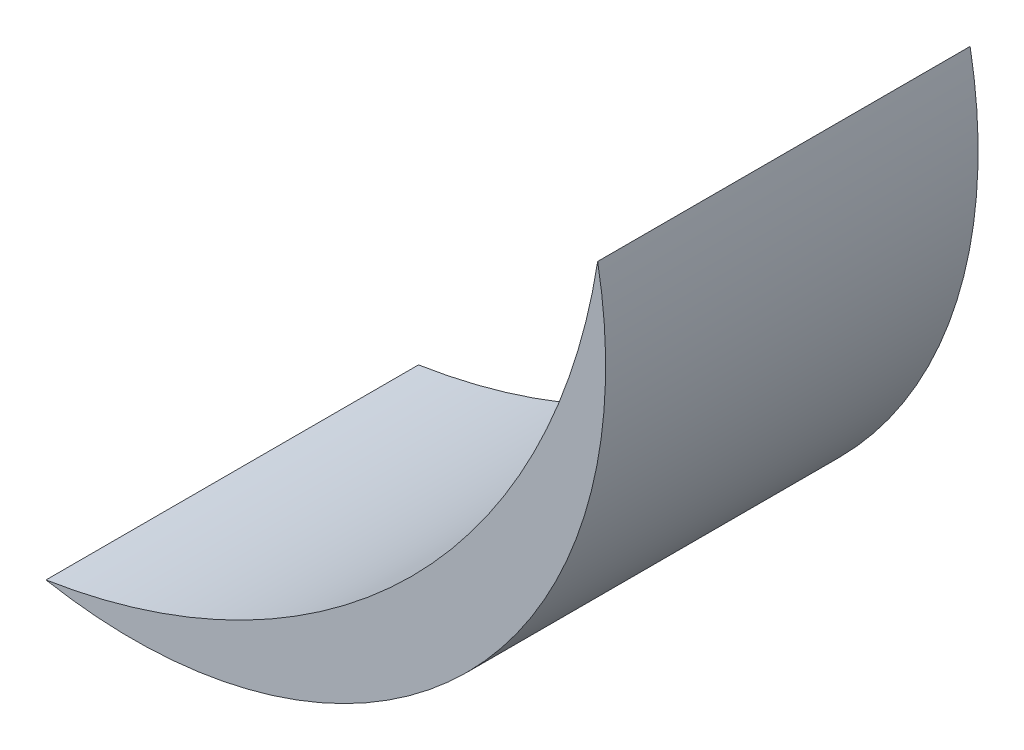
ISO-10303-21;
HEADER;
FILE_DESCRIPTION(('STEP AP214'),'2;1');
FILE_NAME('part.step','',(''),(''),'','','');
FILE_SCHEMA(('AUTOMOTIVE_DESIGN { 1 0 10303 214 1 1 1 1 }'));
ENDSEC;
DATA;
#1=APPLICATION_CONTEXT('core data for automotive mechanical design processes');
#2=APPLICATION_PROTOCOL_DEFINITION('international standard','automotive_design',2000,#1);
#3=PRODUCT_CONTEXT('',#1,'mechanical');
#4=PRODUCT('Part','Part','',(#3));
#5=PRODUCT_RELATED_PRODUCT_CATEGORY('part','',(#4));
#6=PRODUCT_DEFINITION_FORMATION('','',#4);
#7=PRODUCT_DEFINITION_CONTEXT('part definition',#1,'design');
#8=PRODUCT_DEFINITION('design','',#6,#7);
#9=PRODUCT_DEFINITION_SHAPE('','',#8);
#10=(LENGTH_UNIT() NAMED_UNIT(*) SI_UNIT(.MILLI.,.METRE.));
#11=(NAMED_UNIT(*) PLANE_ANGLE_UNIT() SI_UNIT($,.RADIAN.));
#12=(NAMED_UNIT(*) SI_UNIT($,.STERADIAN.) SOLID_ANGLE_UNIT());
#13=UNCERTAINTY_MEASURE_WITH_UNIT(LENGTH_MEASURE(1.E-05),#10,'distance_accuracy_value','');
#14=(GEOMETRIC_REPRESENTATION_CONTEXT(3) GLOBAL_UNCERTAINTY_ASSIGNED_CONTEXT((#13)) GLOBAL_UNIT_ASSIGNED_CONTEXT((#10,
#11,#12)) REPRESENTATION_CONTEXT('',''));
#15=CARTESIAN_POINT('',(0.,0.,0.));
#16=DIRECTION('',(0.,0.,1.));
#17=DIRECTION('',(1.,0.,0.));
#18=AXIS2_PLACEMENT_3D('',#15,#16,#17);
#19=CARTESIAN_POINT('',(119.35459873,97.81540127,0.));
#20=DIRECTION('',(0.,0.,-1.));
#21=DIRECTION('',(-0.707106781186576,-0.70710678118652,0.));
#22=AXIS2_PLACEMENT_3D('',#19,#20,#21);
#23=CYLINDRICAL_SURFACE('',#22,0.253999360179539);
#24=CARTESIAN_POINT('',(119.35459873,97.81540127,0.1999996));
#25=DIRECTION('',(0.,0.,1.));
#26=DIRECTION('',(-0.707106781186576,-0.70710678118652,0.));
#27=AXIS2_PLACEMENT_3D('',#24,#25,#26);
#28=CIRCLE('',#27,0.253999360179539);
#29=CARTESIAN_POINT('',(119.308098731475,97.5656945918579,0.1999996));
#30=VERTEX_POINT('',#29);
#31=CARTESIAN_POINT('',(119.604305408142,97.8619012685254,0.1999996));
#32=VERTEX_POINT('',#31);
#33=EDGE_CURVE('E11',#30,#32,#28,.T.);
#34=ORIENTED_EDGE('',*,*,#33,.F.);
#35=DIRECTION('',(0.,0.,1.));
#36=VECTOR('',#35,1.);
#37=CARTESIAN_POINT('',(119.308098731475,97.5656945918579,0.));
#38=LINE('',#37,#36);
#39=CARTESIAN_POINT('',(119.308098731475,97.5656945918579,0.));
#40=VERTEX_POINT('',#39);
#41=EDGE_CURVE('E24',#40,#30,#38,.T.);
#42=ORIENTED_EDGE('',*,*,#41,.F.);
#43=CARTESIAN_POINT('',(119.35459873,97.81540127,0.));
#44=DIRECTION('',(0.,0.,1.));
#45=DIRECTION('',(-0.707106781186576,-0.70710678118652,0.));
#46=AXIS2_PLACEMENT_3D('',#43,#44,#45);
#47=CIRCLE('',#46,0.253999360179539);
#48=CARTESIAN_POINT('',(119.604305408142,97.8619012685254,0.));
#49=VERTEX_POINT('',#48);
#50=EDGE_CURVE('E46',#40,#49,#47,.T.);
#51=ORIENTED_EDGE('',*,*,#50,.T.);
#52=DIRECTION('',(0.,0.,1.));
#53=VECTOR('',#52,1.);
#54=CARTESIAN_POINT('',(119.604305408142,97.8619012685254,0.));
#55=LINE('',#54,#53);
#56=EDGE_CURVE('E37',#49,#32,#55,.T.);
#57=ORIENTED_EDGE('',*,*,#56,.T.);
#58=EDGE_LOOP('',(#34,#42,#51,#57));
#59=FACE_BOUND('',#58,.T.);
#60=ADVANCED_FACE('F17',(#59),#23,.T.);
#61=CARTESIAN_POINT('',(119.253,97.917,0.));
#62=DIRECTION('',(0.,0.,-1.));
#63=DIRECTION('',(1.,0.,0.));
#64=AXIS2_PLACEMENT_3D('',#61,#62,#63);
#65=CYLINDRICAL_SURFACE('',#64,0.3556);
#66=ORIENTED_EDGE('',*,*,#41,.T.);
#67=CARTESIAN_POINT('',(119.253,97.917,0.1999996));
#68=DIRECTION('',(0.,0.,1.));
#69=DIRECTION('',(1.,0.,0.));
#70=AXIS2_PLACEMENT_3D('',#67,#68,#69);
#71=CIRCLE('',#70,0.3556);
#72=EDGE_CURVE('E45',#30,#32,#71,.T.);
#73=ORIENTED_EDGE('',*,*,#72,.T.);
#74=ORIENTED_EDGE('',*,*,#56,.F.);
#75=CARTESIAN_POINT('',(119.253,97.917,0.));
#76=DIRECTION('',(0.,0.,1.));
#77=DIRECTION('',(1.,0.,0.));
#78=AXIS2_PLACEMENT_3D('',#75,#76,#77);
#79=CIRCLE('',#78,0.3556);
#80=EDGE_CURVE('E43',#40,#49,#79,.T.);
#81=ORIENTED_EDGE('',*,*,#80,.F.);
#82=EDGE_LOOP('',(#66,#73,#74,#81));
#83=FACE_BOUND('',#82,.T.);
#84=ADVANCED_FACE('F41',(#83),#65,.F.);
#85=CARTESIAN_POINT('',(119.0733966,97.73739406,0.));
#86=DIRECTION('',(0.,0.,-1.));
#87=DIRECTION('',(-1.,0.,0.));
#88=AXIS2_PLACEMENT_3D('',#85,#86,#87);
#89=PLANE('',#88);
#90=ORIENTED_EDGE('',*,*,#50,.F.);
#91=ORIENTED_EDGE('',*,*,#80,.T.);
#92=EDGE_LOOP('',(#90,#91));
#93=FACE_BOUND('',#92,.T.);
#94=ADVANCED_FACE('F51',(#93),#89,.T.);
#95=CARTESIAN_POINT('',(119.0733966,97.73739406,0.1999996));
#96=DIRECTION('',(0.,0.,-1.));
#97=DIRECTION('',(-1.,0.,0.));
#98=AXIS2_PLACEMENT_3D('',#95,#96,#97);
#99=PLANE('',#98);
#100=ORIENTED_EDGE('',*,*,#72,.F.);
#101=ORIENTED_EDGE('',*,*,#33,.T.);
#102=EDGE_LOOP('',(#100,#101));
#103=FACE_BOUND('',#102,.T.);
#104=ADVANCED_FACE('F55',(#103),#99,.F.);
#105=CLOSED_SHELL('',(#60,#84,#94,#104));
#106=MANIFOLD_SOLID_BREP('B1',#105);
#107=ADVANCED_BREP_SHAPE_REPRESENTATION('',(#18,#106),#14);
#108=SHAPE_DEFINITION_REPRESENTATION(#9,#107);
ENDSEC;
END-ISO-10303-21;
